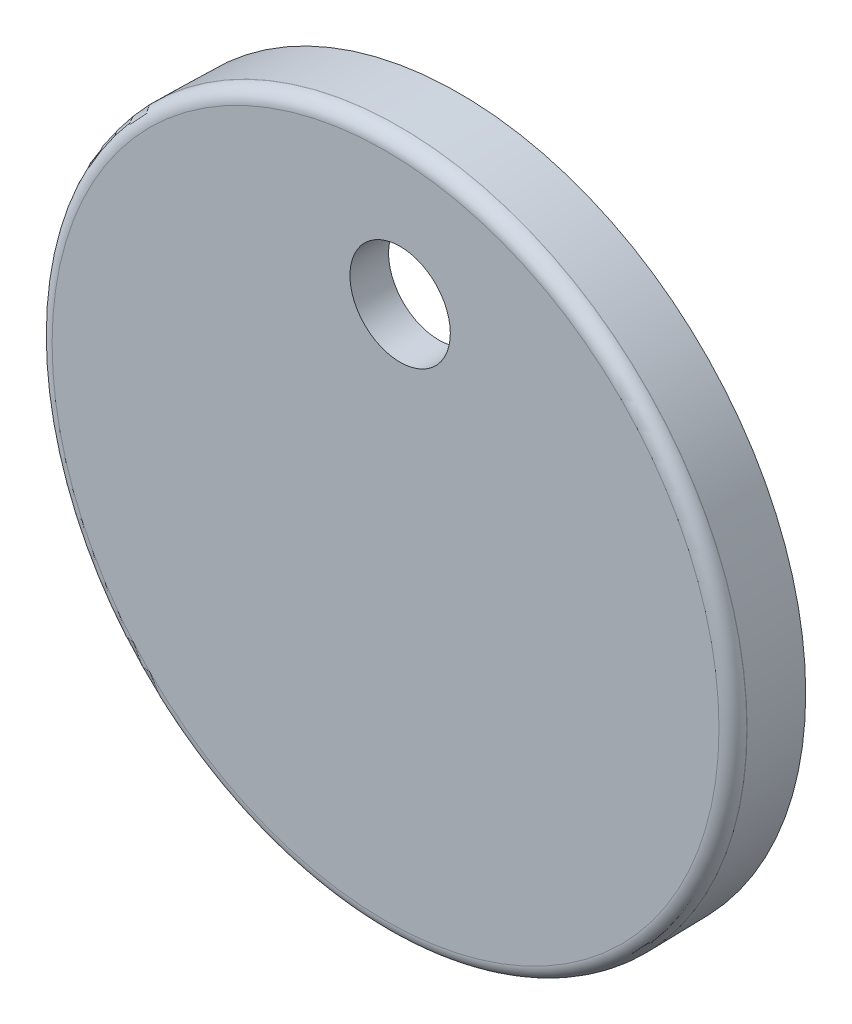
ISO-10303-21;
HEADER;
FILE_DESCRIPTION(('STEP AP214'),'2;1');
FILE_NAME('part.step','',(''),(''),'','','');
FILE_SCHEMA(('AUTOMOTIVE_DESIGN { 1 0 10303 214 1 1 1 1 }'));
ENDSEC;
DATA;
#1=APPLICATION_CONTEXT('core data for automotive mechanical design processes');
#2=APPLICATION_PROTOCOL_DEFINITION('international standard','automotive_design',2000,#1);
#3=PRODUCT_CONTEXT('',#1,'mechanical');
#4=PRODUCT('Part','Part','',(#3));
#5=PRODUCT_RELATED_PRODUCT_CATEGORY('part','',(#4));
#6=PRODUCT_DEFINITION_FORMATION('','',#4);
#7=PRODUCT_DEFINITION_CONTEXT('part definition',#1,'design');
#8=PRODUCT_DEFINITION('design','',#6,#7);
#9=PRODUCT_DEFINITION_SHAPE('','',#8);
#10=(LENGTH_UNIT() NAMED_UNIT(*) SI_UNIT(.MILLI.,.METRE.));
#11=(NAMED_UNIT(*) PLANE_ANGLE_UNIT() SI_UNIT($,.RADIAN.));
#12=(NAMED_UNIT(*) SI_UNIT($,.STERADIAN.) SOLID_ANGLE_UNIT());
#13=UNCERTAINTY_MEASURE_WITH_UNIT(LENGTH_MEASURE(1.E-05),#10,'distance_accuracy_value','');
#14=(GEOMETRIC_REPRESENTATION_CONTEXT(3) GLOBAL_UNCERTAINTY_ASSIGNED_CONTEXT((#13)) GLOBAL_UNIT_ASSIGNED_CONTEXT((#10,
#11,#12)) REPRESENTATION_CONTEXT('',''));
#15=CARTESIAN_POINT('',(0.,0.,0.));
#16=DIRECTION('',(0.,0.,1.));
#17=DIRECTION('',(1.,0.,0.));
#18=AXIS2_PLACEMENT_3D('',#15,#16,#17);
#19=CARTESIAN_POINT('',(0.,0.,0.));
#20=DIRECTION('',(0.,0.,-1.));
#21=DIRECTION('',(1.,0.,0.));
#22=AXIS2_PLACEMENT_3D('',#19,#20,#21);
#23=CONICAL_SURFACE('',#22,49.5,0.0174532925199433);
#24=CARTESIAN_POINT('',(0.,0.,0.0349048128745672));
#25=DIRECTION('',(0.,0.,-1.));
#26=DIRECTION('',(-1.,0.,0.));
#27=AXIS2_PLACEMENT_3D('',#24,#25,#26);
#28=CIRCLE('',#27,49.499390734225);
#29=CARTESIAN_POINT('',(-49.499390734225,0.,0.0349048128745672));
#30=VERTEX_POINT('',#29);
#31=EDGE_CURVE('E93',#30,#30,#28,.T.);
#32=ORIENTED_EDGE('',*,*,#31,.T.);
#33=EDGE_LOOP('',(#32));
#34=FACE_BOUND('',#33,.T.);
#35=CARTESIAN_POINT('',(0.,0.,0.));
#36=DIRECTION('',(0.,0.,-1.));
#37=DIRECTION('',(-1.,0.,0.));
#38=AXIS2_PLACEMENT_3D('',#35,#36,#37);
#39=CIRCLE('',#38,49.5);
#40=CARTESIAN_POINT('',(-49.5,0.,0.));
#41=VERTEX_POINT('',#40);
#42=EDGE_CURVE('E197',#41,#41,#39,.T.);
#43=ORIENTED_EDGE('',*,*,#42,.F.);
#44=EDGE_LOOP('',(#43));
#45=FACE_BOUND('',#44,.T.);
#46=ADVANCED_FACE('F39',(#34,#45),#23,.T.);
#47=CARTESIAN_POINT('',(0.,0.,2.));
#48=DIRECTION('',(0.,0.,1.));
#49=DIRECTION('',(1.,0.,0.));
#50=AXIS2_PLACEMENT_3D('',#47,#48,#49);
#51=PLANE('',#50);
#52=CARTESIAN_POINT('',(2.07565397754373,29.5948083249736,2.));
#53=DIRECTION('',(0.,0.,1.));
#54=DIRECTION('',(1.,0.,0.));
#55=AXIS2_PLACEMENT_3D('',#52,#53,#54);
#56=CIRCLE('',#55,7.15);
#57=CARTESIAN_POINT('',(9.22565397754373,29.5948083249736,2.));
#58=VERTEX_POINT('',#57);
#59=EDGE_CURVE('E184',#58,#58,#56,.T.);
#60=ORIENTED_EDGE('',*,*,#59,.F.);
#61=EDGE_LOOP('',(#60));
#62=FACE_BOUND('',#61,.T.);
#63=CARTESIAN_POINT('',(0.,0.,2.));
#64=DIRECTION('',(0.,0.,1.));
#65=DIRECTION('',(1.,0.,0.));
#66=AXIS2_PLACEMENT_3D('',#63,#64,#65);
#67=CIRCLE('',#66,47.4996953439122);
#68=CARTESIAN_POINT('',(47.4996953439122,0.,2.));
#69=VERTEX_POINT('',#68);
#70=EDGE_CURVE('E115',#69,#69,#67,.T.);
#71=ORIENTED_EDGE('',*,*,#70,.T.);
#72=EDGE_LOOP('',(#71));
#73=FACE_BOUND('',#72,.T.);
#74=ADVANCED_FACE('F128',(#62,#73),#51,.T.);
#75=CARTESIAN_POINT('',(0.,0.,0.));
#76=DIRECTION('',(0.,0.,1.));
#77=DIRECTION('',(1.,0.,0.));
#78=AXIS2_PLACEMENT_3D('',#75,#76,#77);
#79=TOROIDAL_SURFACE('',#78,47.4996953439122,2.);
#80=ORIENTED_EDGE('',*,*,#31,.F.);
#81=EDGE_LOOP('',(#80));
#82=FACE_BOUND('',#81,.T.);
#83=ORIENTED_EDGE('',*,*,#70,.F.);
#84=EDGE_LOOP('',(#83));
#85=FACE_BOUND('',#84,.T.);
#86=ADVANCED_FACE('F41',(#82,#85),#79,.T.);
#87=CARTESIAN_POINT('',(0.,0.,0.));
#88=DIRECTION('',(0.,0.,1.));
#89=DIRECTION('',(-1.,0.,0.));
#90=AXIS2_PLACEMENT_3D('',#87,#88,#89);
#91=CONICAL_SURFACE('',#90,49.5,0.0174532925199433);
#92=CARTESIAN_POINT('',(0.,0.,-8.5));
#93=DIRECTION('',(0.,0.,-1.));
#94=DIRECTION('',(-1.,0.,0.));
#95=AXIS2_PLACEMENT_3D('',#92,#93,#94);
#96=CIRCLE('',#95,49.3516319481102);
#97=CARTESIAN_POINT('',(-49.3516319481102,0.,-8.5));
#98=VERTEX_POINT('',#97);
#99=EDGE_CURVE('E203',#98,#98,#96,.T.);
#100=ORIENTED_EDGE('',*,*,#99,.F.);
#101=EDGE_LOOP('',(#100));
#102=FACE_BOUND('',#101,.T.);
#103=ORIENTED_EDGE('',*,*,#42,.T.);
#104=EDGE_LOOP('',(#103));
#105=FACE_BOUND('',#104,.T.);
#106=ADVANCED_FACE('F127',(#102,#105),#91,.T.);
#107=CARTESIAN_POINT('',(0.,0.,-8.5));
#108=DIRECTION('',(0.,0.,-1.));
#109=DIRECTION('',(-1.,0.,0.));
#110=AXIS2_PLACEMENT_3D('',#107,#108,#109);
#111=PLANE('',#110);
#112=CARTESIAN_POINT('',(0.,0.,-8.5));
#113=DIRECTION('',(0.,0.,-1.));
#114=DIRECTION('',(-1.,0.,0.));
#115=AXIS2_PLACEMENT_3D('',#112,#113,#114);
#116=CIRCLE('',#115,47.8516319481102);
#117=CARTESIAN_POINT('',(-47.8516319481102,0.,-8.5));
#118=VERTEX_POINT('',#117);
#119=EDGE_CURVE('E191',#118,#118,#116,.T.);
#120=ORIENTED_EDGE('',*,*,#119,.F.);
#121=EDGE_LOOP('',(#120));
#122=FACE_BOUND('',#121,.T.);
#123=ORIENTED_EDGE('',*,*,#99,.T.);
#124=EDGE_LOOP('',(#123));
#125=FACE_BOUND('',#124,.T.);
#126=ADVANCED_FACE('F156',(#122,#125),#111,.T.);
#127=CARTESIAN_POINT('',(0.,0.,-3.5));
#128=DIRECTION('',(0.,0.,-1.));
#129=DIRECTION('',(-1.,0.,0.));
#130=AXIS2_PLACEMENT_3D('',#127,#128,#129);
#131=CYLINDRICAL_SURFACE('',#130,47.8516319481102);
#132=CARTESIAN_POINT('',(0.,0.,-3.5));
#133=DIRECTION('',(0.,0.,-1.));
#134=DIRECTION('',(-1.,0.,0.));
#135=AXIS2_PLACEMENT_3D('',#132,#133,#134);
#136=CIRCLE('',#135,47.8516319481102);
#137=CARTESIAN_POINT('',(-47.8516319481102,0.,-3.5));
#138=VERTEX_POINT('',#137);
#139=EDGE_CURVE('E193',#138,#138,#136,.T.);
#140=ORIENTED_EDGE('',*,*,#139,.F.);
#141=EDGE_LOOP('',(#140));
#142=FACE_BOUND('',#141,.T.);
#143=ORIENTED_EDGE('',*,*,#119,.T.);
#144=EDGE_LOOP('',(#143));
#145=FACE_BOUND('',#144,.T.);
#146=ADVANCED_FACE('F160',(#142,#145),#131,.F.);
#147=CARTESIAN_POINT('',(0.,0.,-3.5));
#148=DIRECTION('',(0.,0.,-1.));
#149=DIRECTION('',(-1.,0.,0.));
#150=AXIS2_PLACEMENT_3D('',#147,#148,#149);
#151=PLANE('',#150);
#152=CARTESIAN_POINT('',(2.07565397754373,29.5948083249736,-3.5));
#153=DIRECTION('',(0.,0.,-1.));
#154=DIRECTION('',(-1.,0.,0.));
#155=AXIS2_PLACEMENT_3D('',#152,#153,#154);
#156=CIRCLE('',#155,7.15);
#157=CARTESIAN_POINT('',(-5.07434602245627,29.5948083249736,-3.5));
#158=VERTEX_POINT('',#157);
#159=EDGE_CURVE('E43',#158,#158,#156,.T.);
#160=ORIENTED_EDGE('',*,*,#159,.F.);
#161=EDGE_LOOP('',(#160));
#162=FACE_BOUND('',#161,.T.);
#163=CARTESIAN_POINT('',(0.,0.,-3.5));
#164=DIRECTION('',(0.,0.,-1.));
#165=DIRECTION('',(-1.,0.,0.));
#166=AXIS2_PLACEMENT_3D('',#163,#164,#165);
#167=CIRCLE('',#166,4.);
#168=CARTESIAN_POINT('',(-4.,0.,-3.5));
#169=VERTEX_POINT('',#168);
#170=EDGE_CURVE('E83',#169,#169,#167,.T.);
#171=ORIENTED_EDGE('',*,*,#170,.F.);
#172=EDGE_LOOP('',(#171));
#173=FACE_BOUND('',#172,.T.);
#174=ORIENTED_EDGE('',*,*,#139,.T.);
#175=EDGE_LOOP('',(#174));
#176=FACE_BOUND('',#175,.T.);
#177=ADVANCED_FACE('F164',(#162,#173,#176),#151,.T.);
#178=CARTESIAN_POINT('',(0.,0.,-8.5));
#179=DIRECTION('',(0.,0.,-1.));
#180=DIRECTION('',(-1.,0.,0.));
#181=AXIS2_PLACEMENT_3D('',#178,#179,#180);
#182=PLANE('',#181);
#183=CARTESIAN_POINT('',(0.0291615283094654,0.00682144678663781,-8.5));
#184=DIRECTION('',(0.,0.,-1.));
#185=DIRECTION('',(-1.,0.,0.));
#186=AXIS2_PLACEMENT_3D('',#183,#184,#185);
#187=CIRCLE('',#186,4.);
#188=CARTESIAN_POINT('',(0.925657435521056,-3.89142111728667,-8.5));
#189=VERTEX_POINT('',#188);
#190=CARTESIAN_POINT('',(-0.89649590721159,3.8982425640733,-8.5));
#191=VERTEX_POINT('',#190);
#192=EDGE_CURVE('E11',#189,#191,#187,.F.);
#193=ORIENTED_EDGE('',*,*,#192,.T.);
#194=CARTESIAN_POINT('',(0.,0.,-8.5));
#195=DIRECTION('',(0.,0.,-1.));
#196=DIRECTION('',(-1.,0.,0.));
#197=AXIS2_PLACEMENT_3D('',#194,#195,#196);
#198=CIRCLE('',#197,4.);
#199=EDGE_CURVE('E55',#191,#189,#198,.T.);
#200=ORIENTED_EDGE('',*,*,#199,.T.);
#201=EDGE_LOOP('',(#193,#200));
#202=FACE_BOUND('',#201,.T.);
#203=ADVANCED_FACE('F74',(#202),#182,.F.);
#204=CARTESIAN_POINT('',(0.,0.,-3.5));
#205=DIRECTION('',(0.,0.,-1.));
#206=DIRECTION('',(-1.,0.,0.));
#207=AXIS2_PLACEMENT_3D('',#204,#205,#206);
#208=CYLINDRICAL_SURFACE('',#207,4.);
#209=ORIENTED_EDGE('',*,*,#170,.T.);
#210=EDGE_LOOP('',(#209));
#211=FACE_BOUND('',#210,.T.);
#212=ORIENTED_EDGE('',*,*,#199,.F.);
#213=EDGE_CURVE('E80',#189,#191,#198,.T.);
#214=ORIENTED_EDGE('',*,*,#213,.F.);
#215=EDGE_LOOP('',(#212,#214));
#216=FACE_BOUND('',#215,.T.);
#217=ADVANCED_FACE('F79',(#211,#216),#208,.T.);
#218=CARTESIAN_POINT('',(0.,0.,-8.5));
#219=DIRECTION('',(0.,0.,-1.));
#220=DIRECTION('',(-1.,0.,0.));
#221=AXIS2_PLACEMENT_3D('',#218,#219,#220);
#222=CIRCLE('',#221,2.8);
#223=CARTESIAN_POINT('',(1.6764838243731,2.24263282474313,-8.5));
#224=VERTEX_POINT('',#223);
#225=CARTESIAN_POINT('',(1.6764838243731,-2.24263282474313,-8.5));
#226=VERTEX_POINT('',#225);
#227=EDGE_CURVE('E62',#224,#226,#222,.F.);
#228=ORIENTED_EDGE('',*,*,#227,.F.);
#229=DIRECTION('',(0.,1.,0.));
#230=VECTOR('',#229,1.);
#231=CARTESIAN_POINT('',(1.6764838243731,2.24263282474313,-8.5));
#232=LINE('',#231,#230);
#233=EDGE_CURVE('E91',#226,#224,#232,.T.);
#234=ORIENTED_EDGE('',*,*,#233,.F.);
#235=EDGE_LOOP('',(#228,#234));
#236=FACE_BOUND('',#235,.T.);
#237=ADVANCED_FACE('F149',(#236),#111,.T.);
#238=CARTESIAN_POINT('',(0.,0.,-3.));
#239=DIRECTION('',(0.,0.,-1.));
#240=DIRECTION('',(-1.,0.,0.));
#241=AXIS2_PLACEMENT_3D('',#238,#239,#240);
#242=CYLINDRICAL_SURFACE('',#241,2.8);
#243=DIRECTION('',(0.,0.,-1.));
#244=VECTOR('',#243,1.);
#245=CARTESIAN_POINT('',(1.6764838243731,2.24263282474313,-3.));
#246=LINE('',#245,#244);
#247=CARTESIAN_POINT('',(1.6764838243731,2.24263282474313,-13.));
#248=VERTEX_POINT('',#247);
#249=EDGE_CURVE('E105',#224,#248,#246,.T.);
#250=ORIENTED_EDGE('',*,*,#249,.F.);
#251=ORIENTED_EDGE('',*,*,#227,.T.);
#252=DIRECTION('',(0.,0.,-1.));
#253=VECTOR('',#252,1.);
#254=CARTESIAN_POINT('',(1.6764838243731,-2.24263282474313,-3.));
#255=LINE('',#254,#253);
#256=CARTESIAN_POINT('',(1.6764838243731,-2.24263282474313,-13.));
#257=VERTEX_POINT('',#256);
#258=EDGE_CURVE('E106',#226,#257,#255,.T.);
#259=ORIENTED_EDGE('',*,*,#258,.T.);
#260=CARTESIAN_POINT('',(0.,0.,-13.));
#261=DIRECTION('',(0.,0.,-1.));
#262=DIRECTION('',(-1.,0.,0.));
#263=AXIS2_PLACEMENT_3D('',#260,#261,#262);
#264=CIRCLE('',#263,2.8);
#265=EDGE_CURVE('E97',#257,#248,#264,.T.);
#266=ORIENTED_EDGE('',*,*,#265,.T.);
#267=EDGE_LOOP('',(#250,#251,#259,#266));
#268=FACE_BOUND('',#267,.T.);
#269=ADVANCED_FACE('F146',(#268),#242,.F.);
#270=CARTESIAN_POINT('',(1.6764838243731,2.24263282474313,-3.));
#271=DIRECTION('',(1.,0.,0.));
#272=DIRECTION('',(0.,0.,-1.));
#273=AXIS2_PLACEMENT_3D('',#270,#271,#272);
#274=PLANE('',#273);
#275=ORIENTED_EDGE('',*,*,#258,.F.);
#276=ORIENTED_EDGE('',*,*,#233,.T.);
#277=ORIENTED_EDGE('',*,*,#249,.T.);
#278=DIRECTION('',(0.,-1.,0.));
#279=VECTOR('',#278,1.);
#280=CARTESIAN_POINT('',(1.6764838243731,2.24263282474313,-13.));
#281=LINE('',#280,#279);
#282=EDGE_CURVE('E101',#248,#257,#281,.T.);
#283=ORIENTED_EDGE('',*,*,#282,.T.);
#284=EDGE_LOOP('',(#275,#276,#277,#283));
#285=FACE_BOUND('',#284,.T.);
#286=ADVANCED_FACE('F144',(#285),#274,.F.);
#287=CARTESIAN_POINT('',(0.0291615283094654,0.00682144678663781,-13.));
#288=DIRECTION('',(0.,0.,1.));
#289=DIRECTION('',(1.,0.,0.));
#290=AXIS2_PLACEMENT_3D('',#287,#288,#289);
#291=PLANE('',#290);
#292=ORIENTED_EDGE('',*,*,#282,.F.);
#293=ORIENTED_EDGE('',*,*,#265,.F.);
#294=EDGE_LOOP('',(#292,#293));
#295=FACE_BOUND('',#294,.T.);
#296=CARTESIAN_POINT('',(0.0291615283094654,0.00682144678663781,-13.));
#297=DIRECTION('',(0.,0.,1.));
#298=DIRECTION('',(1.,0.,0.));
#299=AXIS2_PLACEMENT_3D('',#296,#297,#298);
#300=CIRCLE('',#299,4.);
#301=CARTESIAN_POINT('',(4.02916152830947,0.00682144678663781,-13.));
#302=VERTEX_POINT('',#301);
#303=EDGE_CURVE('E109',#302,#302,#300,.T.);
#304=ORIENTED_EDGE('',*,*,#303,.F.);
#305=EDGE_LOOP('',(#304));
#306=FACE_BOUND('',#305,.T.);
#307=ADVANCED_FACE('F141',(#295,#306),#291,.F.);
#308=CARTESIAN_POINT('',(0.0291615283094654,0.00682144678663781,-13.));
#309=DIRECTION('',(0.,0.,1.));
#310=DIRECTION('',(1.,0.,0.));
#311=AXIS2_PLACEMENT_3D('',#308,#309,#310);
#312=CYLINDRICAL_SURFACE('',#311,4.);
#313=ORIENTED_EDGE('',*,*,#192,.F.);
#314=EDGE_CURVE('E49',#191,#189,#187,.F.);
#315=ORIENTED_EDGE('',*,*,#314,.F.);
#316=EDGE_LOOP('',(#313,#315));
#317=FACE_BOUND('',#316,.T.);
#318=ORIENTED_EDGE('',*,*,#303,.T.);
#319=EDGE_LOOP('',(#318));
#320=FACE_BOUND('',#319,.T.);
#321=ADVANCED_FACE('F88',(#317,#320),#312,.T.);
#322=ORIENTED_EDGE('',*,*,#314,.T.);
#323=ORIENTED_EDGE('',*,*,#213,.T.);
#324=EDGE_LOOP('',(#322,#323));
#325=FACE_BOUND('',#324,.T.);
#326=ADVANCED_FACE('F86',(#325),#111,.T.);
#327=CARTESIAN_POINT('',(2.07565397754373,29.5948083249736,-8.));
#328=DIRECTION('',(0.,0.,1.));
#329=DIRECTION('',(1.,0.,0.));
#330=AXIS2_PLACEMENT_3D('',#327,#328,#329);
#331=CYLINDRICAL_SURFACE('',#330,7.15);
#332=ORIENTED_EDGE('',*,*,#159,.T.);
#333=EDGE_LOOP('',(#332));
#334=FACE_BOUND('',#333,.T.);
#335=ORIENTED_EDGE('',*,*,#59,.T.);
#336=EDGE_LOOP('',(#335));
#337=FACE_BOUND('',#336,.T.);
#338=ADVANCED_FACE('F174',(#334,#337),#331,.F.);
#339=CLOSED_SHELL('',(#46,#74,#86,#106,#126,#146,#177,#203,#217,#237,#269,#286,#307,#321,#326,#338));
#340=MANIFOLD_SOLID_BREP('B2',#339);
#341=ADVANCED_BREP_SHAPE_REPRESENTATION('',(#18,#340),#14);
#342=SHAPE_DEFINITION_REPRESENTATION(#9,#341);
ENDSEC;
END-ISO-10303-21;
